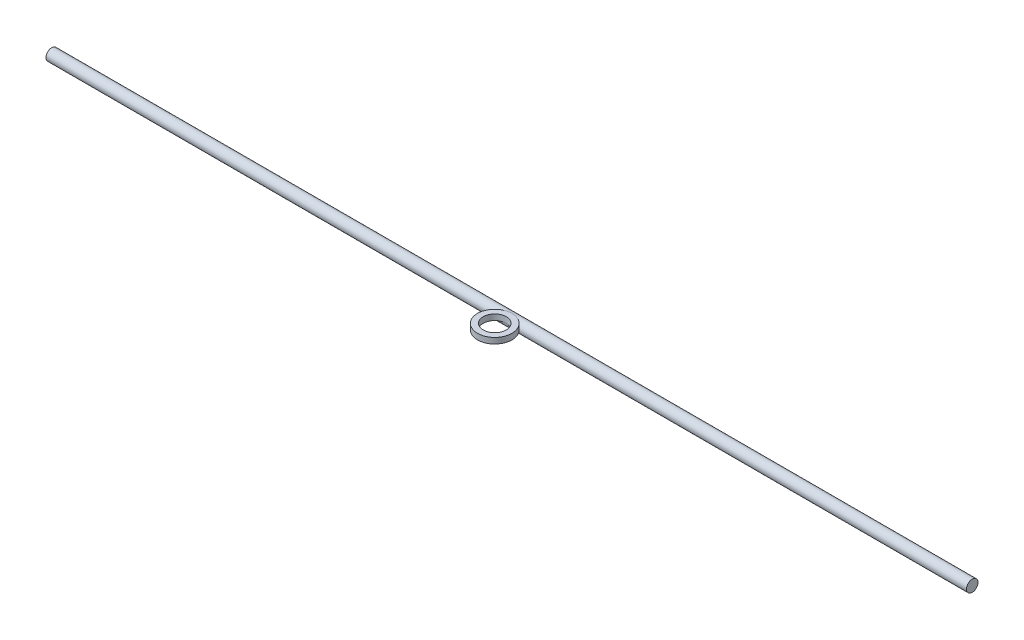
ISO-10303-21;
HEADER;
FILE_DESCRIPTION(('STEP AP214'),'2;1');
FILE_NAME('part.step','',(''),(''),'','','');
FILE_SCHEMA(('AUTOMOTIVE_DESIGN { 1 0 10303 214 1 1 1 1 }'));
ENDSEC;
DATA;
#1=APPLICATION_CONTEXT('core data for automotive mechanical design processes');
#2=APPLICATION_PROTOCOL_DEFINITION('international standard','automotive_design',2000,#1);
#3=PRODUCT_CONTEXT('',#1,'mechanical');
#4=PRODUCT('Part','Part','',(#3));
#5=PRODUCT_RELATED_PRODUCT_CATEGORY('part','',(#4));
#6=PRODUCT_DEFINITION_FORMATION('','',#4);
#7=PRODUCT_DEFINITION_CONTEXT('part definition',#1,'design');
#8=PRODUCT_DEFINITION('design','',#6,#7);
#9=PRODUCT_DEFINITION_SHAPE('','',#8);
#10=(LENGTH_UNIT() NAMED_UNIT(*) SI_UNIT(.MILLI.,.METRE.));
#11=(NAMED_UNIT(*) PLANE_ANGLE_UNIT() SI_UNIT($,.RADIAN.));
#12=(NAMED_UNIT(*) SI_UNIT($,.STERADIAN.) SOLID_ANGLE_UNIT());
#13=UNCERTAINTY_MEASURE_WITH_UNIT(LENGTH_MEASURE(1.E-05),#10,'distance_accuracy_value','');
#14=(GEOMETRIC_REPRESENTATION_CONTEXT(3) GLOBAL_UNCERTAINTY_ASSIGNED_CONTEXT((#13)) GLOBAL_UNIT_ASSIGNED_CONTEXT((#10,
#11,#12)) REPRESENTATION_CONTEXT('',''));
#15=CARTESIAN_POINT('',(0.,0.,0.));
#16=DIRECTION('',(0.,0.,1.));
#17=DIRECTION('',(1.,0.,0.));
#18=AXIS2_PLACEMENT_3D('',#15,#16,#17);
#19=CARTESIAN_POINT('',(-400.,0.,0.));
#20=DIRECTION('',(1.,0.,0.));
#21=DIRECTION('',(0.,0.,-1.));
#22=AXIS2_PLACEMENT_3D('',#19,#20,#21);
#23=CYLINDRICAL_SURFACE('',#22,5.);
#24=CARTESIAN_POINT('',(400.,0.,0.));
#25=DIRECTION('',(1.,0.,0.));
#26=DIRECTION('',(0.,0.,-1.));
#27=AXIS2_PLACEMENT_3D('',#24,#25,#26);
#28=CIRCLE('',#27,5.);
#29=CARTESIAN_POINT('',(400.,0.,-5.));
#30=VERTEX_POINT('',#29);
#31=EDGE_CURVE('E89',#30,#30,#28,.T.);
#32=ORIENTED_EDGE('',*,*,#31,.F.);
#33=EDGE_LOOP('',(#32));
#34=FACE_BOUND('',#33,.T.);
#35=CARTESIAN_POINT('',(-400.,0.,0.));
#36=DIRECTION('',(1.,0.,0.));
#37=DIRECTION('',(0.,0.,-1.));
#38=AXIS2_PLACEMENT_3D('',#35,#36,#37);
#39=CIRCLE('',#38,5.);
#40=CARTESIAN_POINT('',(-400.,0.,-5.));
#41=VERTEX_POINT('',#40);
#42=EDGE_CURVE('E137',#41,#41,#39,.T.);
#43=ORIENTED_EDGE('',*,*,#42,.T.);
#44=EDGE_LOOP('',(#43));
#45=FACE_BOUND('',#44,.T.);
#46=CARTESIAN_POINT('',(0.,5.,0.));
#47=CARTESIAN_POINT('',(0.209617565625922,4.99997515097394,-2.76746314304132E-06));
#48=CARTESIAN_POINT('',(0.419234929773609,4.99999913645348,0.00439385076033513));
#49=CARTESIAN_POINT('',(0.838103171705836,4.99996612140728,0.0219660483411523));
#50=CARTESIAN_POINT('',(1.04735404634526,4.99990912018991,0.0351417026712459));
#51=CARTESIAN_POINT('',(1.4653005283991,4.99953530926221,0.0702673646683333));
#52=CARTESIAN_POINT('',(1.67399549801033,4.99921827459685,0.0922249611663367));
#53=CARTESIAN_POINT('',(2.09027771780069,4.99797052201268,0.144874522305536));
#54=CARTESIAN_POINT('',(2.29786497533589,4.99703980817431,0.175566428870359));
#55=CARTESIAN_POINT('',(2.71342728659697,4.99407262891926,0.245945553091192));
#56=CARTESIAN_POINT('',(2.9213889777574,4.99202627472464,0.285711338647192));
#57=CARTESIAN_POINT('',(3.33541912398075,4.98618883418459,0.374003175726979));
#58=CARTESIAN_POINT('',(3.54148759552819,4.98239776304537,0.422529150898477));
#59=CARTESIAN_POINT('',(3.95122291548887,4.97230395720485,0.528214589863567));
#60=CARTESIAN_POINT('',(4.15489099826753,4.966002577112,0.585369387074316));
#61=CARTESIAN_POINT('',(4.55948545661232,4.94997947574179,0.708191561693384));
#62=CARTESIAN_POINT('',(4.76041209422272,4.94025808378349,0.773858119104719));
#63=CARTESIAN_POINT('',(5.21570301323768,4.91295314308722,0.933374022410124));
#64=CARTESIAN_POINT('',(5.46904179504116,4.89392099047641,1.02993150133486));
#65=CARTESIAN_POINT('',(5.96934121475422,4.84591040620243,1.23627333605818));
#66=CARTESIAN_POINT('',(6.21630182905808,4.81693193773342,1.34605774080138));
#67=CARTESIAN_POINT('',(6.70158382917697,4.74613331572175,1.57760145905068));
#68=CARTESIAN_POINT('',(6.93993325825449,4.70436003935184,1.69931597442817));
#69=CARTESIAN_POINT('',(7.4071562220395,4.60451323342091,1.95374827349159));
#70=CARTESIAN_POINT('',(7.63603354213967,4.54644628900178,2.08646159673436));
#71=CARTESIAN_POINT('',(8.00949767710657,4.43237445701909,2.31618376398334));
#72=CARTESIAN_POINT('',(8.15726911887295,4.38185186031488,2.41075158624595));
#73=CARTESIAN_POINT('',(8.4466718681484,4.27040793238407,2.60306935984406));
#74=CARTESIAN_POINT('',(8.58830488743232,4.20948952386067,2.70081841056748));
#75=CARTESIAN_POINT('',(8.86442362508757,4.07602191675694,2.89831546743748));
#76=CARTESIAN_POINT('',(8.99891381495299,4.00348011160283,2.99806216785869));
#77=CARTESIAN_POINT('',(9.25967396319292,3.84559032621602,3.19807318111962));
#78=CARTESIAN_POINT('',(9.38594621077146,3.76024593437641,3.29833734134266));
#79=CARTESIAN_POINT('',(9.6928711906204,3.52721236151558,3.54987376425855));
#80=CARTESIAN_POINT('',(9.86736294084677,3.37028282979346,3.70035452526087));
#81=CARTESIAN_POINT('',(10.1893675913855,3.02197472975696,3.98983686384428));
#82=CARTESIAN_POINT('',(10.3369115512679,2.83063633204862,4.12885155433058));
#83=CARTESIAN_POINT('',(10.578921800732,2.4477852201047,4.36466706956217));
#84=CARTESIAN_POINT('',(10.6781107010928,2.26127807871117,4.46466018064878));
#85=CARTESIAN_POINT('',(10.8079735473173,1.96613503749563,4.59848174399985));
#86=CARTESIAN_POINT('',(10.8481075520593,1.86519098675677,4.6403940347472));
#87=CARTESIAN_POINT('',(10.9218264497697,1.65869544953245,4.71814347921852));
#88=CARTESIAN_POINT('',(10.9554138926028,1.55314577660586,4.75398299755418));
#89=CARTESIAN_POINT('',(11.0175827224958,1.33174727581294,4.82085047718113));
#90=CARTESIAN_POINT('',(11.0457513831275,1.2156583249168,4.85146934440504));
#91=CARTESIAN_POINT('',(11.0942441308039,0.98001381062749,4.90450440880617));
#92=CARTESIAN_POINT('',(11.1145682791957,0.860458274352172,4.92692067013074));
#93=CARTESIAN_POINT('',(11.1473188414283,0.618078860464836,4.96317176174874));
#94=CARTESIAN_POINT('',(11.1596869564662,0.495237576774383,4.97694322891879));
#95=CARTESIAN_POINT('',(11.1762056281895,0.248269061957907,4.99537836525594));
#96=CARTESIAN_POINT('',(11.1803523096115,0.124141252110422,5.00003773932345));
#97=CARTESIAN_POINT('',(11.180339887499,0.,5.00000000000001));
#98=B_SPLINE_CURVE_WITH_KNOTS('',3,(#46,#47,#48,#49,#50,#51,#52,#53,#54,#55,#56,#57,#58,#59,#60,
#61,#62,#63,#64,#65,#66,#67,#68,#69,#70,#71,#72,#73,#74,#75,#76,#77,#78,#79,#80,#81,#82,#83,#84,
#85,#86,#87,#88,#89,#90,#91,#92,#93,#94,#95,#96,#97),.UNSPECIFIED.,.F.,.F.,(4,2,2,2,2,2,2,2,2,2,
2,2,2,2,2,2,2,2,2,2,2,2,2,2,2,4),(0.,0.628806298726712,1.25761796751273,1.88697419598281,
2.51632623982095,3.15134961921382,3.78636746412054,4.42104310498472,5.05565764851537,
5.8704593327851,6.68526403222073,7.49711848142377,8.308645288283,8.85599098651117,
9.40318305542464,9.95002843736953,10.4967208312954,11.3297750021383,12.16186286462,
12.85974473502,13.208681272877,13.5574816282876,13.9268787495009,14.2962729818332,
14.668344057094,15.0405904705005),.UNSPECIFIED.);
#99=CARTESIAN_POINT('',(0.,5.,0.));
#100=VERTEX_POINT('',#99);
#101=CARTESIAN_POINT('',(11.180339887499,0.,5.));
#102=VERTEX_POINT('',#101);
#103=EDGE_CURVE('E80',#100,#102,#98,.T.);
#104=ORIENTED_EDGE('',*,*,#103,.T.);
#105=DIRECTION('',(1.,0.,0.));
#106=VECTOR('',#105,1.);
#107=CARTESIAN_POINT('',(-400.,0.,5.));
#108=LINE('',#107,#106);
#109=CARTESIAN_POINT('',(0.,0.,5.));
#110=VERTEX_POINT('',#109);
#111=EDGE_CURVE('E12',#102,#110,#108,.F.);
#112=ORIENTED_EDGE('',*,*,#111,.T.);
#113=CARTESIAN_POINT('',(-11.180339887499,0.,5.));
#114=VERTEX_POINT('',#113);
#115=EDGE_CURVE('E49',#110,#114,#108,.F.);
#116=ORIENTED_EDGE('',*,*,#115,.T.);
#117=CARTESIAN_POINT('',(-11.180339887499,0.,5.));
#118=CARTESIAN_POINT('',(-11.1803478124042,0.111199309233328,5.00002434400299));
#119=CARTESIAN_POINT('',(-11.1770224635019,0.222390613801253,4.99629143335284));
#120=CARTESIAN_POINT('',(-11.1637644984269,0.443851479881225,4.98148995920972));
#121=CARTESIAN_POINT('',(-11.153834086847,0.554121336517335,4.97042384334878));
#122=CARTESIAN_POINT('',(-11.127487863678,0.772389823475092,4.94120408789962));
#123=CARTESIAN_POINT('',(-11.1111030506033,0.880396748354943,4.92308432963243));
#124=CARTESIAN_POINT('',(-11.0719590586056,1.093879673838,4.88009028926966));
#125=CARTESIAN_POINT('',(-11.049199643154,1.19935558037042,4.85521575654014));
#126=CARTESIAN_POINT('',(-10.9974803677187,1.40694054342556,4.79917291055836));
#127=CARTESIAN_POINT('',(-10.9685269952689,1.50905299467097,4.76801118442331));
#128=CARTESIAN_POINT('',(-10.9046001178019,1.70940803990808,4.69990878701589));
#129=CARTESIAN_POINT('',(-10.8696242648192,1.80764910614915,4.66296586236));
#130=CARTESIAN_POINT('',(-10.7559609312182,2.09575922895411,4.54431784089635));
#131=CARTESIAN_POINT('',(-10.6685206653911,2.27908320047588,4.45477461590696));
#132=CARTESIAN_POINT('',(-10.4687236611054,2.63178965087897,4.25633325237267));
#133=CARTESIAN_POINT('',(-10.3555074075281,2.80031673726229,4.14680230915454));
#134=CARTESIAN_POINT('',(-10.1091082669942,3.113742625549,3.91693763391967));
#135=CARTESIAN_POINT('',(-9.97591597739786,3.25863023303114,3.79659882544263));
#136=CARTESIAN_POINT('',(-9.7260910173783,3.49358081886103,3.57967820364428));
#137=CARTESIAN_POINT('',(-9.61298508048802,3.58850789597719,3.48420392517666));
#138=CARTESIAN_POINT('',(-9.37801602557748,3.76555461816428,3.29206086752508));
#139=CARTESIAN_POINT('',(-9.25614923317514,3.8476688430907,3.19539160139363));
#140=CARTESIAN_POINT('',(-9.00463956267724,4.00006843637689,3.002432182329));
#141=CARTESIAN_POINT('',(-8.87498512299868,4.070335596837,2.90614283112865));
#142=CARTESIAN_POINT('',(-8.60903039807747,4.19998861114547,2.71539943914443));
#143=CARTESIAN_POINT('',(-8.47272792442421,4.25937085085049,2.62094601722028));
#144=CARTESIAN_POINT('',(-8.12243433112409,4.39653169704712,2.38689532085992));
#145=CARTESIAN_POINT('',(-7.90468586923008,4.46796564482174,2.24918471762661));
#146=CARTESIAN_POINT('',(-7.45843279627917,4.59225913998932,1.98311098035356));
#147=CARTESIAN_POINT('',(-7.22992246978075,4.64510868846344,1.8547529075847));
#148=CARTESIAN_POINT('',(-6.76362097433299,4.73590956572732,1.60884299674367));
#149=CARTESIAN_POINT('',(-6.52580866056413,4.77382448788292,1.49131809422988));
#150=CARTESIAN_POINT('',(-6.04300741296344,4.83779014395956,1.26854860015478));
#151=CARTESIAN_POINT('',(-5.79801893022829,4.86384162192504,1.16330323876055));
#152=CARTESIAN_POINT('',(-5.36495307256899,4.90142325822662,0.990824265451532));
#153=CARTESIAN_POINT('',(-5.17818144635675,4.91496023302534,0.920715517827979));
#154=CARTESIAN_POINT('',(-4.80176191822246,4.9379850124174,0.787930141269854));
#155=CARTESIAN_POINT('',(-4.61211375009069,4.94747243984818,0.725254204997205));
#156=CARTESIAN_POINT('',(-4.03929551413687,4.97124735814931,0.548573493036376));
#157=CARTESIAN_POINT('',(-3.65235214126967,4.98083982383086,0.445955826040189));
#158=CARTESIAN_POINT('',(-2.87210350727384,4.99334570317874,0.272113252355258));
#159=CARTESIAN_POINT('',(-2.47880897764805,4.9962693943766,0.200840176226471));
#160=CARTESIAN_POINT('',(-1.68796899448436,4.99950216110414,0.0899363146111027));
#161=CARTESIAN_POINT('',(-1.29042652862767,4.99981296689045,0.050284605159269));
#162=CARTESIAN_POINT('',(-0.74343880374246,4.99997299467004,0.0176940734255432));
#163=CARTESIAN_POINT('',(-0.594711951186908,4.99998944003085,0.0110543862129684));
#164=CARTESIAN_POINT('',(-0.29732849315208,5.00000176128523,0.00221081446807926));
#165=CARTESIAN_POINT('',(-0.148672066407026,4.99999766507276,9.20306317791022E-07));
#166=CARTESIAN_POINT('',(0.,5.,0.));
#167=B_SPLINE_CURVE_WITH_KNOTS('',3,(#117,#118,#119,#120,#121,#122,#123,#124,#125,#126,#127,
#128,#129,#130,#131,#132,#133,#134,#135,#136,#137,#138,#139,#140,#141,#142,#143,#144,#145,#146,
#147,#148,#149,#150,#151,#152,#153,#154,#155,#156,#157,#158,#159,#160,#161,#162,#163,#164,#165,
#166),.UNSPECIFIED.,.F.,.F.,(4,2,2,2,2,2,2,2,2,2,2,2,2,2,2,2,2,2,2,2,2,2,2,2,4),(0.,
0.333473142708143,0.666835036830583,0.998615042230364,1.33040735991325,1.66185384594892,
1.99342984577352,2.65636670985117,3.34592324597871,4.03580537818995,4.56262937719034,
5.08967563473108,5.61752467468843,6.14554866126362,6.94635664053433,7.74759481970213,
8.55077429174956,9.35390338352502,9.95356817134691,10.5532887979478,11.7530540712473,
12.9509690824103,14.1480907699194,14.5946655256782,15.0406340296239),.UNSPECIFIED.);
#168=EDGE_CURVE('E82',#114,#100,#167,.T.);
#169=ORIENTED_EDGE('',*,*,#168,.T.);
#170=EDGE_LOOP('',(#104,#112,#116,#169));
#171=FACE_BOUND('',#170,.T.);
#172=ADVANCED_FACE('F45',(#34,#45,#171),#23,.T.);
#173=CARTESIAN_POINT('',(-400.,0.,0.));
#174=DIRECTION('',(1.,0.,0.));
#175=DIRECTION('',(0.,0.,-1.));
#176=AXIS2_PLACEMENT_3D('',#173,#174,#175);
#177=PLANE('',#176);
#178=ORIENTED_EDGE('',*,*,#42,.F.);
#179=EDGE_LOOP('',(#178));
#180=FACE_BOUND('',#179,.T.);
#181=ADVANCED_FACE('F47',(#180),#177,.F.);
#182=CARTESIAN_POINT('',(400.,0.,0.));
#183=DIRECTION('',(1.,0.,0.));
#184=DIRECTION('',(0.,0.,-1.));
#185=AXIS2_PLACEMENT_3D('',#182,#183,#184);
#186=PLANE('',#185);
#187=ORIENTED_EDGE('',*,*,#31,.T.);
#188=EDGE_LOOP('',(#187));
#189=FACE_BOUND('',#188,.T.);
#190=ADVANCED_FACE('F113',(#189),#186,.T.);
#191=CARTESIAN_POINT('',(0.,5.,15.));
#192=DIRECTION('',(0.,1.,0.));
#193=DIRECTION('',(0.,0.,1.));
#194=AXIS2_PLACEMENT_3D('',#191,#192,#193);
#195=PLANE('',#194);
#196=CARTESIAN_POINT('',(0.,5.,15.));
#197=DIRECTION('',(0.,1.,0.));
#198=DIRECTION('',(0.,0.,1.));
#199=AXIS2_PLACEMENT_3D('',#196,#197,#198);
#200=CIRCLE('',#199,15.);
#201=EDGE_CURVE('E61',#100,#100,#200,.T.);
#202=ORIENTED_EDGE('',*,*,#201,.T.);
#203=EDGE_LOOP('',(#202));
#204=FACE_BOUND('',#203,.T.);
#205=CARTESIAN_POINT('',(0.,5.,15.));
#206=DIRECTION('',(0.,1.,0.));
#207=DIRECTION('',(0.,0.,1.));
#208=AXIS2_PLACEMENT_3D('',#205,#206,#207);
#209=CIRCLE('',#208,10.);
#210=CARTESIAN_POINT('',(0.,5.,25.));
#211=VERTEX_POINT('',#210);
#212=EDGE_CURVE('E84',#211,#211,#209,.T.);
#213=ORIENTED_EDGE('',*,*,#212,.F.);
#214=EDGE_LOOP('',(#213));
#215=FACE_BOUND('',#214,.T.);
#216=ADVANCED_FACE('F110',(#204,#215),#195,.T.);
#217=CARTESIAN_POINT('',(0.,0.,15.));
#218=DIRECTION('',(0.,1.,0.));
#219=DIRECTION('',(0.,0.,1.));
#220=AXIS2_PLACEMENT_3D('',#217,#218,#219);
#221=PLANE('',#220);
#222=ORIENTED_EDGE('',*,*,#111,.F.);
#223=CARTESIAN_POINT('',(0.,0.,15.));
#224=DIRECTION('',(0.,1.,0.));
#225=DIRECTION('',(0.,0.,1.));
#226=AXIS2_PLACEMENT_3D('',#223,#224,#225);
#227=CIRCLE('',#226,15.);
#228=EDGE_CURVE('E74',#114,#102,#227,.T.);
#229=ORIENTED_EDGE('',*,*,#228,.F.);
#230=ORIENTED_EDGE('',*,*,#115,.F.);
#231=CARTESIAN_POINT('',(0.,0.,15.));
#232=DIRECTION('',(0.,1.,0.));
#233=DIRECTION('',(0.,0.,1.));
#234=AXIS2_PLACEMENT_3D('',#231,#232,#233);
#235=CIRCLE('',#234,10.);
#236=EDGE_CURVE('E76',#110,#110,#235,.T.);
#237=ORIENTED_EDGE('',*,*,#236,.T.);
#238=EDGE_LOOP('',(#222,#229,#230,#237));
#239=FACE_BOUND('',#238,.T.);
#240=ADVANCED_FACE('F73',(#239),#221,.F.);
#241=CARTESIAN_POINT('',(0.,5.,15.));
#242=DIRECTION('',(0.,-1.,0.));
#243=DIRECTION('',(0.,0.,-1.));
#244=AXIS2_PLACEMENT_3D('',#241,#242,#243);
#245=CYLINDRICAL_SURFACE('',#244,15.);
#246=ORIENTED_EDGE('',*,*,#103,.F.);
#247=ORIENTED_EDGE('',*,*,#201,.F.);
#248=ORIENTED_EDGE('',*,*,#168,.F.);
#249=ORIENTED_EDGE('',*,*,#228,.T.);
#250=EDGE_LOOP('',(#246,#247,#248,#249));
#251=FACE_BOUND('',#250,.T.);
#252=ADVANCED_FACE('F79',(#251),#245,.T.);
#253=CARTESIAN_POINT('',(0.,5.,15.));
#254=DIRECTION('',(0.,-1.,0.));
#255=DIRECTION('',(0.,0.,-1.));
#256=AXIS2_PLACEMENT_3D('',#253,#254,#255);
#257=CYLINDRICAL_SURFACE('',#256,10.);
#258=ORIENTED_EDGE('',*,*,#212,.T.);
#259=EDGE_LOOP('',(#258));
#260=FACE_BOUND('',#259,.T.);
#261=ORIENTED_EDGE('',*,*,#236,.F.);
#262=EDGE_LOOP('',(#261));
#263=FACE_BOUND('',#262,.T.);
#264=ADVANCED_FACE('F106',(#260,#263),#257,.F.);
#265=CLOSED_SHELL('',(#172,#181,#190,#216,#240,#252,#264));
#266=MANIFOLD_SOLID_BREP('B2',#265);
#267=ADVANCED_BREP_SHAPE_REPRESENTATION('',(#18,#266),#14);
#268=SHAPE_DEFINITION_REPRESENTATION(#9,#267);
ENDSEC;
END-ISO-10303-21;
